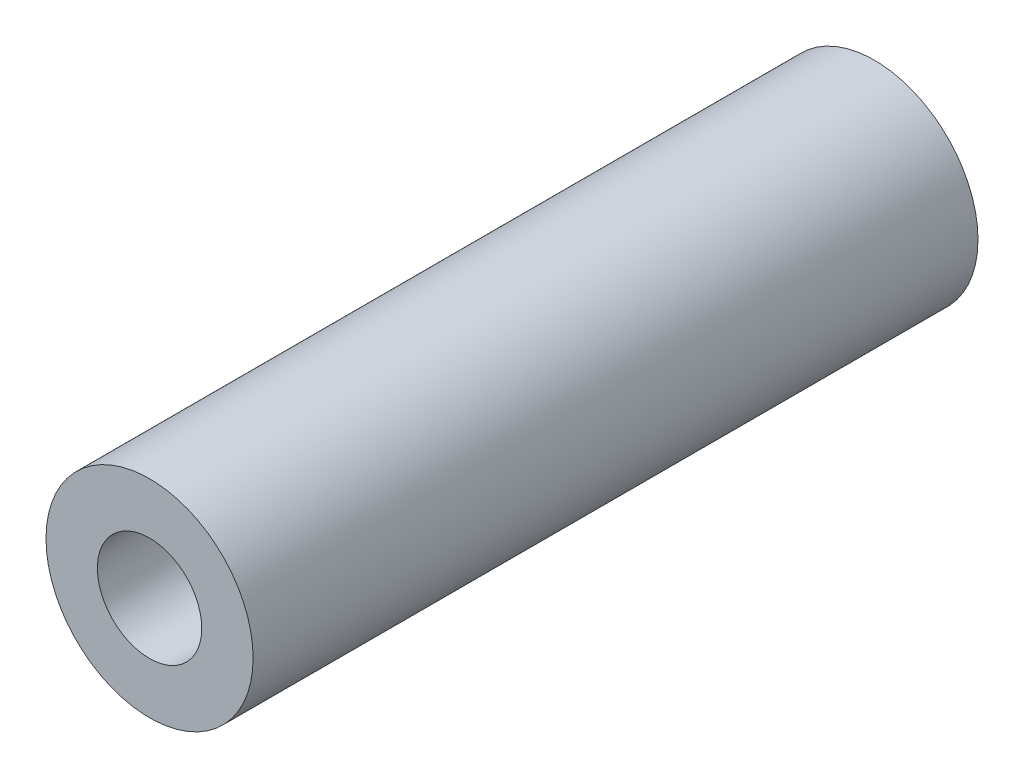
ISO-10303-21;
HEADER;
FILE_DESCRIPTION(('STEP AP214'),'2;1');
FILE_NAME('part.step','',(''),(''),'','','');
FILE_SCHEMA(('AUTOMOTIVE_DESIGN { 1 0 10303 214 1 1 1 1 }'));
ENDSEC;
DATA;
#1=APPLICATION_CONTEXT('core data for automotive mechanical design processes');
#2=APPLICATION_PROTOCOL_DEFINITION('international standard','automotive_design',2000,#1);
#3=PRODUCT_CONTEXT('',#1,'mechanical');
#4=PRODUCT('Part','Part','',(#3));
#5=PRODUCT_RELATED_PRODUCT_CATEGORY('part','',(#4));
#6=PRODUCT_DEFINITION_FORMATION('','',#4);
#7=PRODUCT_DEFINITION_CONTEXT('part definition',#1,'design');
#8=PRODUCT_DEFINITION('design','',#6,#7);
#9=PRODUCT_DEFINITION_SHAPE('','',#8);
#10=(LENGTH_UNIT() NAMED_UNIT(*) SI_UNIT(.MILLI.,.METRE.));
#11=(NAMED_UNIT(*) PLANE_ANGLE_UNIT() SI_UNIT($,.RADIAN.));
#12=(NAMED_UNIT(*) SI_UNIT($,.STERADIAN.) SOLID_ANGLE_UNIT());
#13=UNCERTAINTY_MEASURE_WITH_UNIT(LENGTH_MEASURE(1.E-05),#10,'distance_accuracy_value','');
#14=(GEOMETRIC_REPRESENTATION_CONTEXT(3) GLOBAL_UNCERTAINTY_ASSIGNED_CONTEXT((#13)) GLOBAL_UNIT_ASSIGNED_CONTEXT((#10,
#11,#12)) REPRESENTATION_CONTEXT('',''));
#15=CARTESIAN_POINT('',(0.,0.,0.));
#16=DIRECTION('',(0.,0.,1.));
#17=DIRECTION('',(1.,0.,0.));
#18=AXIS2_PLACEMENT_3D('',#15,#16,#17);
#19=CARTESIAN_POINT('',(0.,0.,22.225));
#20=DIRECTION('',(0.,0.,1.));
#21=DIRECTION('',(1.,0.,0.));
#22=AXIS2_PLACEMENT_3D('',#19,#20,#21);
#23=PLANE('',#22);
#24=CARTESIAN_POINT('',(0.,0.,22.225));
#25=DIRECTION('',(0.,0.,1.));
#26=DIRECTION('',(1.,0.,0.));
#27=AXIS2_PLACEMENT_3D('',#24,#25,#26);
#28=CIRCLE('',#27,6.35);
#29=CARTESIAN_POINT('',(6.35,0.,22.225));
#30=VERTEX_POINT('',#29);
#31=EDGE_CURVE('E10',#30,#30,#28,.T.);
#32=ORIENTED_EDGE('',*,*,#31,.T.);
#33=EDGE_LOOP('',(#32));
#34=FACE_BOUND('',#33,.T.);
#35=CARTESIAN_POINT('',(0.,0.,22.225));
#36=DIRECTION('',(0.,0.,1.));
#37=DIRECTION('',(1.,0.,0.));
#38=AXIS2_PLACEMENT_3D('',#35,#36,#37);
#39=CIRCLE('',#38,3.2004);
#40=CARTESIAN_POINT('',(3.2004,0.,22.225));
#41=VERTEX_POINT('',#40);
#42=EDGE_CURVE('E46',#41,#41,#39,.T.);
#43=ORIENTED_EDGE('',*,*,#42,.F.);
#44=EDGE_LOOP('',(#43));
#45=FACE_BOUND('',#44,.T.);
#46=ADVANCED_FACE('F35',(#34,#45),#23,.T.);
#47=CARTESIAN_POINT('',(0.,0.,-22.225));
#48=DIRECTION('',(0.,0.,1.));
#49=DIRECTION('',(1.,0.,0.));
#50=AXIS2_PLACEMENT_3D('',#47,#48,#49);
#51=PLANE('',#50);
#52=CARTESIAN_POINT('',(0.,0.,-22.225));
#53=DIRECTION('',(0.,0.,1.));
#54=DIRECTION('',(1.,0.,0.));
#55=AXIS2_PLACEMENT_3D('',#52,#53,#54);
#56=CIRCLE('',#55,6.35);
#57=CARTESIAN_POINT('',(6.35,0.,-22.225));
#58=VERTEX_POINT('',#57);
#59=EDGE_CURVE('E39',#58,#58,#56,.T.);
#60=ORIENTED_EDGE('',*,*,#59,.F.);
#61=EDGE_LOOP('',(#60));
#62=FACE_BOUND('',#61,.T.);
#63=CARTESIAN_POINT('',(0.,0.,-22.225));
#64=DIRECTION('',(0.,0.,1.));
#65=DIRECTION('',(1.,0.,0.));
#66=AXIS2_PLACEMENT_3D('',#63,#64,#65);
#67=CIRCLE('',#66,3.2004);
#68=CARTESIAN_POINT('',(3.2004,0.,-22.225));
#69=VERTEX_POINT('',#68);
#70=EDGE_CURVE('E48',#69,#69,#67,.T.);
#71=ORIENTED_EDGE('',*,*,#70,.T.);
#72=EDGE_LOOP('',(#71));
#73=FACE_BOUND('',#72,.T.);
#74=ADVANCED_FACE('F58',(#62,#73),#51,.F.);
#75=CARTESIAN_POINT('',(0.,0.,22.225));
#76=DIRECTION('',(0.,0.,-1.));
#77=DIRECTION('',(-1.,0.,0.));
#78=AXIS2_PLACEMENT_3D('',#75,#76,#77);
#79=CYLINDRICAL_SURFACE('',#78,6.35);
#80=ORIENTED_EDGE('',*,*,#31,.F.);
#81=EDGE_LOOP('',(#80));
#82=FACE_BOUND('',#81,.T.);
#83=ORIENTED_EDGE('',*,*,#59,.T.);
#84=EDGE_LOOP('',(#83));
#85=FACE_BOUND('',#84,.T.);
#86=ADVANCED_FACE('F37',(#82,#85),#79,.T.);
#87=CARTESIAN_POINT('',(0.,0.,22.225));
#88=DIRECTION('',(0.,0.,-1.));
#89=DIRECTION('',(-1.,0.,0.));
#90=AXIS2_PLACEMENT_3D('',#87,#88,#89);
#91=CYLINDRICAL_SURFACE('',#90,3.2004);
#92=ORIENTED_EDGE('',*,*,#42,.T.);
#93=EDGE_LOOP('',(#92));
#94=FACE_BOUND('',#93,.T.);
#95=ORIENTED_EDGE('',*,*,#70,.F.);
#96=EDGE_LOOP('',(#95));
#97=FACE_BOUND('',#96,.T.);
#98=ADVANCED_FACE('F54',(#94,#97),#91,.F.);
#99=CLOSED_SHELL('',(#46,#74,#86,#98));
#100=MANIFOLD_SOLID_BREP('B2',#99);
#101=ADVANCED_BREP_SHAPE_REPRESENTATION('',(#18,#100),#14);
#102=SHAPE_DEFINITION_REPRESENTATION(#9,#101);
ENDSEC;
END-ISO-10303-21;
